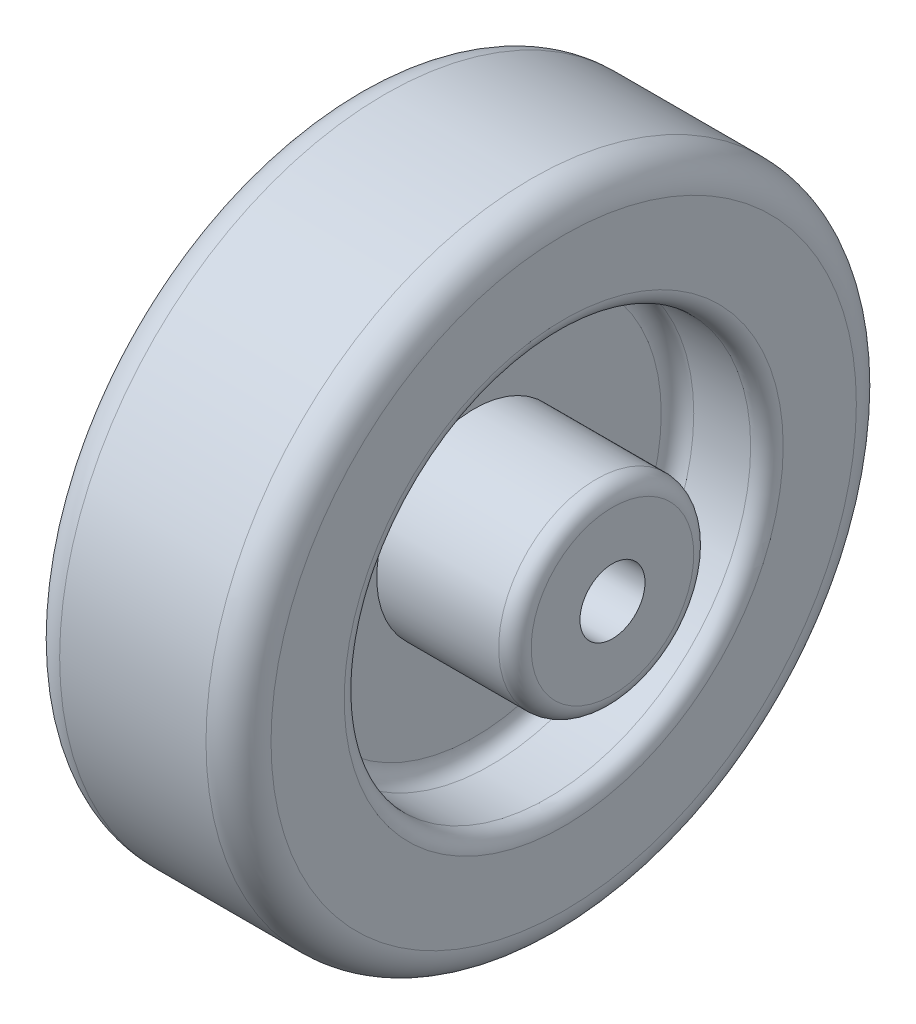
ISO-10303-21;
HEADER;
FILE_DESCRIPTION(('STEP AP214'),'2;1');
FILE_NAME('part.step','',(''),(''),'','','');
FILE_SCHEMA(('AUTOMOTIVE_DESIGN { 1 0 10303 214 1 1 1 1 }'));
ENDSEC;
DATA;
#1=APPLICATION_CONTEXT('core data for automotive mechanical design processes');
#2=APPLICATION_PROTOCOL_DEFINITION('international standard','automotive_design',2000,#1);
#3=PRODUCT_CONTEXT('',#1,'mechanical');
#4=PRODUCT('Part','Part','',(#3));
#5=PRODUCT_RELATED_PRODUCT_CATEGORY('part','',(#4));
#6=PRODUCT_DEFINITION_FORMATION('','',#4);
#7=PRODUCT_DEFINITION_CONTEXT('part definition',#1,'design');
#8=PRODUCT_DEFINITION('design','',#6,#7);
#9=PRODUCT_DEFINITION_SHAPE('','',#8);
#10=(LENGTH_UNIT() NAMED_UNIT(*) SI_UNIT(.MILLI.,.METRE.));
#11=(NAMED_UNIT(*) PLANE_ANGLE_UNIT() SI_UNIT($,.RADIAN.));
#12=(NAMED_UNIT(*) SI_UNIT($,.STERADIAN.) SOLID_ANGLE_UNIT());
#13=UNCERTAINTY_MEASURE_WITH_UNIT(LENGTH_MEASURE(1.E-05),#10,'distance_accuracy_value','');
#14=(GEOMETRIC_REPRESENTATION_CONTEXT(3) GLOBAL_UNCERTAINTY_ASSIGNED_CONTEXT((#13)) GLOBAL_UNIT_ASSIGNED_CONTEXT((#10,
#11,#12)) REPRESENTATION_CONTEXT('',''));
#15=CARTESIAN_POINT('',(0.,0.,0.));
#16=DIRECTION('',(0.,0.,1.));
#17=DIRECTION('',(1.,0.,0.));
#18=AXIS2_PLACEMENT_3D('',#15,#16,#17);
#19=CARTESIAN_POINT('',(-19.,0.,0.));
#20=DIRECTION('',(-1.,0.,0.));
#21=DIRECTION('',(0.,0.,-1.));
#22=AXIS2_PLACEMENT_3D('',#19,#20,#21);
#23=PLANE('',#22);
#24=CARTESIAN_POINT('',(-19.,0.,0.));
#25=DIRECTION('',(-1.,0.,0.));
#26=DIRECTION('',(0.,0.,1.));
#27=AXIS2_PLACEMENT_3D('',#24,#25,#26);
#28=CIRCLE('',#27,10.);
#29=CARTESIAN_POINT('',(-19.,0.,10.));
#30=VERTEX_POINT('',#29);
#31=EDGE_CURVE('E42',#30,#30,#28,.T.);
#32=ORIENTED_EDGE('',*,*,#31,.T.);
#33=EDGE_LOOP('',(#32));
#34=FACE_BOUND('',#33,.T.);
#35=CARTESIAN_POINT('',(-19.,0.,0.));
#36=DIRECTION('',(1.,0.,0.));
#37=DIRECTION('',(0.,0.,-1.));
#38=AXIS2_PLACEMENT_3D('',#35,#36,#37);
#39=CIRCLE('',#38,4.);
#40=CARTESIAN_POINT('',(-19.,0.,-4.));
#41=VERTEX_POINT('',#40);
#42=EDGE_CURVE('E96',#41,#41,#39,.T.);
#43=ORIENTED_EDGE('',*,*,#42,.T.);
#44=EDGE_LOOP('',(#43));
#45=FACE_BOUND('',#44,.T.);
#46=ADVANCED_FACE('F31',(#34,#45),#23,.T.);
#47=CARTESIAN_POINT('',(-13.,0.,0.));
#48=DIRECTION('',(-1.,0.,0.));
#49=DIRECTION('',(0.,0.,-1.));
#50=AXIS2_PLACEMENT_3D('',#47,#48,#49);
#51=PLANE('',#50);
#52=CARTESIAN_POINT('',(-13.,0.,0.));
#53=DIRECTION('',(-1.,0.,0.));
#54=DIRECTION('',(0.,0.,1.));
#55=AXIS2_PLACEMENT_3D('',#52,#53,#54);
#56=CIRCLE('',#55,36.);
#57=CARTESIAN_POINT('',(-13.,0.,36.));
#58=VERTEX_POINT('',#57);
#59=EDGE_CURVE('E10',#58,#58,#56,.T.);
#60=ORIENTED_EDGE('',*,*,#59,.T.);
#61=EDGE_LOOP('',(#60));
#62=FACE_BOUND('',#61,.T.);
#63=CARTESIAN_POINT('',(-13.,0.,0.));
#64=DIRECTION('',(-1.,0.,0.));
#65=DIRECTION('',(0.,0.,1.));
#66=AXIS2_PLACEMENT_3D('',#63,#64,#65);
#67=CIRCLE('',#66,27.);
#68=CARTESIAN_POINT('',(-13.,0.,27.));
#69=VERTEX_POINT('',#68);
#70=EDGE_CURVE('E51',#69,#69,#67,.F.);
#71=ORIENTED_EDGE('',*,*,#70,.T.);
#72=EDGE_LOOP('',(#71));
#73=FACE_BOUND('',#72,.T.);
#74=ADVANCED_FACE('F119',(#62,#73),#51,.T.);
#75=CARTESIAN_POINT('',(2.,0.,0.));
#76=DIRECTION('',(1.,0.,0.));
#77=DIRECTION('',(0.,0.,-1.));
#78=AXIS2_PLACEMENT_3D('',#75,#76,#77);
#79=PLANE('',#78);
#80=CARTESIAN_POINT('',(2.,0.,0.));
#81=DIRECTION('',(1.,0.,0.));
#82=DIRECTION('',(0.,0.,-1.));
#83=AXIS2_PLACEMENT_3D('',#80,#81,#82);
#84=CIRCLE('',#83,23.);
#85=CARTESIAN_POINT('',(2.,0.,-23.));
#86=VERTEX_POINT('',#85);
#87=EDGE_CURVE('E87',#86,#86,#84,.T.);
#88=ORIENTED_EDGE('',*,*,#87,.T.);
#89=EDGE_LOOP('',(#88));
#90=FACE_BOUND('',#89,.T.);
#91=CARTESIAN_POINT('',(2.,0.,0.));
#92=DIRECTION('',(1.,0.,0.));
#93=DIRECTION('',(0.,0.,-1.));
#94=AXIS2_PLACEMENT_3D('',#91,#92,#93);
#95=CIRCLE('',#94,12.);
#96=CARTESIAN_POINT('',(2.,0.,-12.));
#97=VERTEX_POINT('',#96);
#98=EDGE_CURVE('E90',#97,#97,#95,.T.);
#99=ORIENTED_EDGE('',*,*,#98,.F.);
#100=EDGE_LOOP('',(#99));
#101=FACE_BOUND('',#100,.T.);
#102=ADVANCED_FACE('F125',(#90,#101),#79,.T.);
#103=CARTESIAN_POINT('',(13.,0.,0.));
#104=DIRECTION('',(-1.,0.,0.));
#105=DIRECTION('',(0.,0.,1.));
#106=AXIS2_PLACEMENT_3D('',#103,#104,#105);
#107=CYLINDRICAL_SURFACE('',#106,40.);
#108=CARTESIAN_POINT('',(-9.,0.,0.));
#109=DIRECTION('',(-1.,0.,0.));
#110=DIRECTION('',(0.,0.,1.));
#111=AXIS2_PLACEMENT_3D('',#108,#109,#110);
#112=CIRCLE('',#111,40.);
#113=CARTESIAN_POINT('',(-9.,0.,40.));
#114=VERTEX_POINT('',#113);
#115=EDGE_CURVE('E38',#114,#114,#112,.F.);
#116=CARTESIAN_POINT('',(9.,0.,0.));
#117=DIRECTION('',(1.,0.,0.));
#118=DIRECTION('',(0.,0.,-1.));
#119=AXIS2_PLACEMENT_3D('',#116,#117,#118);
#120=CIRCLE('',#119,40.);
#121=CARTESIAN_POINT('',(9.,0.,40.));
#122=VERTEX_POINT('',#121);
#123=EDGE_CURVE('E66',#122,#122,#120,.F.);
#124=CARTESIAN_POINT('',(-9.,0.,40.));
#125=CARTESIAN_POINT('',(-8.8125,0.,40.));
#126=CARTESIAN_POINT('',(-8.62499999999999,0.,40.));
#127=CARTESIAN_POINT('',(-8.24999999999999,0.,40.));
#128=CARTESIAN_POINT('',(-8.06249999999999,0.,40.));
#129=CARTESIAN_POINT('',(-7.6875,0.,40.));
#130=CARTESIAN_POINT('',(-7.5,0.,40.));
#131=CARTESIAN_POINT('',(-7.125,0.,40.));
#132=CARTESIAN_POINT('',(-6.9375,0.,40.));
#133=CARTESIAN_POINT('',(-6.5625,0.,40.));
#134=CARTESIAN_POINT('',(-6.375,0.,40.));
#135=CARTESIAN_POINT('',(-6.,0.,40.));
#136=CARTESIAN_POINT('',(-5.8125,0.,40.));
#137=CARTESIAN_POINT('',(-5.4375,0.,40.));
#138=CARTESIAN_POINT('',(-5.25,0.,40.));
#139=CARTESIAN_POINT('',(-4.875,0.,40.));
#140=CARTESIAN_POINT('',(-4.6875,0.,40.));
#141=CARTESIAN_POINT('',(-4.3125,0.,40.));
#142=CARTESIAN_POINT('',(-4.125,0.,40.));
#143=CARTESIAN_POINT('',(-3.75,0.,40.));
#144=CARTESIAN_POINT('',(-3.5625,0.,40.));
#145=CARTESIAN_POINT('',(-3.1875,0.,40.));
#146=CARTESIAN_POINT('',(-3.,0.,40.));
#147=CARTESIAN_POINT('',(-2.625,0.,40.));
#148=CARTESIAN_POINT('',(-2.4375,0.,40.));
#149=CARTESIAN_POINT('',(-2.0625,0.,40.));
#150=CARTESIAN_POINT('',(-1.875,0.,40.));
#151=CARTESIAN_POINT('',(-1.5,0.,40.));
#152=CARTESIAN_POINT('',(-1.3125,0.,40.));
#153=CARTESIAN_POINT('',(-0.9375,0.,40.));
#154=CARTESIAN_POINT('',(-0.75,0.,40.));
#155=CARTESIAN_POINT('',(-0.375,0.,40.));
#156=CARTESIAN_POINT('',(-0.1875,0.,40.));
#157=CARTESIAN_POINT('',(0.1875,0.,40.));
#158=CARTESIAN_POINT('',(0.375,0.,40.));
#159=CARTESIAN_POINT('',(0.75,0.,40.));
#160=CARTESIAN_POINT('',(0.9375,0.,40.));
#161=CARTESIAN_POINT('',(1.3125,0.,40.));
#162=CARTESIAN_POINT('',(1.5,0.,40.));
#163=CARTESIAN_POINT('',(1.875,0.,40.));
#164=CARTESIAN_POINT('',(2.0625,0.,40.));
#165=CARTESIAN_POINT('',(2.4375,0.,40.));
#166=CARTESIAN_POINT('',(2.625,0.,40.));
#167=CARTESIAN_POINT('',(3.,0.,40.));
#168=CARTESIAN_POINT('',(3.1875,0.,40.));
#169=CARTESIAN_POINT('',(3.5625,0.,40.));
#170=CARTESIAN_POINT('',(3.75,0.,40.));
#171=CARTESIAN_POINT('',(4.125,0.,40.));
#172=CARTESIAN_POINT('',(4.3125,0.,40.));
#173=CARTESIAN_POINT('',(4.6875,0.,40.));
#174=CARTESIAN_POINT('',(4.875,0.,40.));
#175=CARTESIAN_POINT('',(5.25,0.,40.));
#176=CARTESIAN_POINT('',(5.4375,0.,40.));
#177=CARTESIAN_POINT('',(5.8125,0.,40.));
#178=CARTESIAN_POINT('',(6.,0.,40.));
#179=CARTESIAN_POINT('',(6.375,0.,40.));
#180=CARTESIAN_POINT('',(6.5625,0.,40.));
#181=CARTESIAN_POINT('',(6.9375,0.,40.));
#182=CARTESIAN_POINT('',(7.125,0.,40.));
#183=CARTESIAN_POINT('',(7.5,0.,40.));
#184=CARTESIAN_POINT('',(7.6875,0.,40.));
#185=CARTESIAN_POINT('',(8.0625,0.,40.));
#186=CARTESIAN_POINT('',(8.25,0.,40.));
#187=CARTESIAN_POINT('',(8.625,0.,40.));
#188=CARTESIAN_POINT('',(8.8125,0.,40.));
#189=CARTESIAN_POINT('',(9.,0.,40.));
#190=B_SPLINE_CURVE_WITH_KNOTS('',3,(#124,#125,#126,#127,#128,#129,#130,#131,#132,#133,#134,
#135,#136,#137,#138,#139,#140,#141,#142,#143,#144,#145,#146,#147,#148,#149,#150,#151,#152,#153,
#154,#155,#156,#157,#158,#159,#160,#161,#162,#163,#164,#165,#166,#167,#168,#169,#170,#171,#172,
#173,#174,#175,#176,#177,#178,#179,#180,#181,#182,#183,#184,#185,#186,#187,#188,#189),
.UNSPECIFIED.,.F.,.F.,(4,2,2,2,2,2,2,2,2,2,2,2,2,2,2,2,2,2,2,2,2,2,2,2,2,2,2,2,2,2,2,2,4),(0.,
0.5625,1.125,1.6875,2.25,2.8125,3.375,3.9375,4.5,5.0625,5.625,6.1875,6.75,7.3125,7.875,
8.43749999999999,9.,9.5625,10.125,10.6875,11.25,11.8125,12.375,12.9375,13.5,14.0625,14.625,
15.1875,15.75,16.3125,16.875,17.4375,18.),.UNSPECIFIED.);
#191=EDGE_CURVE('BSEAM171',#114,#122,#190,.T.);
#192=ORIENTED_EDGE('',*,*,#115,.T.);
#193=ORIENTED_EDGE('',*,*,#123,.T.);
#194=ORIENTED_EDGE('',*,*,#191,.T.);
#195=ORIENTED_EDGE('',*,*,#191,.F.);
#196=EDGE_LOOP('',(#192,#194,#193,#195));
#197=FACE_BOUND('',#196,.T.);
#198=ADVANCED_FACE('F171',(#197),#107,.T.);
#199=CARTESIAN_POINT('',(13.,0.,0.));
#200=DIRECTION('',(1.,0.,0.));
#201=DIRECTION('',(0.,0.,-1.));
#202=AXIS2_PLACEMENT_3D('',#199,#200,#201);
#203=PLANE('',#202);
#204=CARTESIAN_POINT('',(13.,0.,0.));
#205=DIRECTION('',(1.,0.,0.));
#206=DIRECTION('',(0.,0.,-1.));
#207=AXIS2_PLACEMENT_3D('',#204,#205,#206);
#208=CIRCLE('',#207,36.);
#209=CARTESIAN_POINT('',(13.,0.,-36.));
#210=VERTEX_POINT('',#209);
#211=EDGE_CURVE('E69',#210,#210,#208,.T.);
#212=ORIENTED_EDGE('',*,*,#211,.T.);
#213=EDGE_LOOP('',(#212));
#214=FACE_BOUND('',#213,.T.);
#215=CARTESIAN_POINT('',(13.,0.,0.));
#216=DIRECTION('',(1.,0.,0.));
#217=DIRECTION('',(0.,0.,-1.));
#218=AXIS2_PLACEMENT_3D('',#215,#216,#217);
#219=CIRCLE('',#218,27.);
#220=CARTESIAN_POINT('',(13.,0.,-27.));
#221=VERTEX_POINT('',#220);
#222=EDGE_CURVE('E78',#221,#221,#219,.F.);
#223=ORIENTED_EDGE('',*,*,#222,.T.);
#224=EDGE_LOOP('',(#223));
#225=FACE_BOUND('',#224,.T.);
#226=ADVANCED_FACE('F174',(#214,#225),#203,.T.);
#227=CARTESIAN_POINT('',(2.,0.,0.));
#228=DIRECTION('',(1.,0.,0.));
#229=DIRECTION('',(0.,0.,-1.));
#230=AXIS2_PLACEMENT_3D('',#227,#228,#229);
#231=CYLINDRICAL_SURFACE('',#230,25.);
#232=CARTESIAN_POINT('',(4.,0.,0.));
#233=DIRECTION('',(1.,0.,0.));
#234=DIRECTION('',(0.,0.,-1.));
#235=AXIS2_PLACEMENT_3D('',#232,#233,#234);
#236=CIRCLE('',#235,25.);
#237=CARTESIAN_POINT('',(4.,0.,-25.));
#238=VERTEX_POINT('',#237);
#239=EDGE_CURVE('E81',#238,#238,#236,.F.);
#240=ORIENTED_EDGE('',*,*,#239,.T.);
#241=EDGE_LOOP('',(#240));
#242=FACE_BOUND('',#241,.T.);
#243=CARTESIAN_POINT('',(11.,0.,0.));
#244=DIRECTION('',(1.,0.,0.));
#245=DIRECTION('',(0.,0.,-1.));
#246=AXIS2_PLACEMENT_3D('',#243,#244,#245);
#247=CIRCLE('',#246,25.);
#248=CARTESIAN_POINT('',(11.,0.,-25.));
#249=VERTEX_POINT('',#248);
#250=EDGE_CURVE('E84',#249,#249,#247,.T.);
#251=ORIENTED_EDGE('',*,*,#250,.T.);
#252=EDGE_LOOP('',(#251));
#253=FACE_BOUND('',#252,.T.);
#254=ADVANCED_FACE('F177',(#242,#253),#231,.F.);
#255=CARTESIAN_POINT('',(19.,0.,0.));
#256=DIRECTION('',(-1.,0.,0.));
#257=DIRECTION('',(0.,0.,1.));
#258=AXIS2_PLACEMENT_3D('',#255,#256,#257);
#259=CYLINDRICAL_SURFACE('',#258,12.);
#260=CARTESIAN_POINT('',(17.,0.,0.));
#261=DIRECTION('',(1.,0.,0.));
#262=DIRECTION('',(0.,0.,-1.));
#263=AXIS2_PLACEMENT_3D('',#260,#261,#262);
#264=CIRCLE('',#263,12.);
#265=CARTESIAN_POINT('',(17.,0.,-12.));
#266=VERTEX_POINT('',#265);
#267=EDGE_CURVE('E72',#266,#266,#264,.F.);
#268=ORIENTED_EDGE('',*,*,#267,.T.);
#269=EDGE_LOOP('',(#268));
#270=FACE_BOUND('',#269,.T.);
#271=ORIENTED_EDGE('',*,*,#98,.T.);
#272=EDGE_LOOP('',(#271));
#273=FACE_BOUND('',#272,.T.);
#274=ADVANCED_FACE('F114',(#270,#273),#259,.T.);
#275=CARTESIAN_POINT('',(19.,0.,0.));
#276=DIRECTION('',(1.,0.,0.));
#277=DIRECTION('',(0.,0.,-1.));
#278=AXIS2_PLACEMENT_3D('',#275,#276,#277);
#279=PLANE('',#278);
#280=CARTESIAN_POINT('',(19.,0.,0.));
#281=DIRECTION('',(1.,0.,0.));
#282=DIRECTION('',(0.,0.,-1.));
#283=AXIS2_PLACEMENT_3D('',#280,#281,#282);
#284=CIRCLE('',#283,10.);
#285=CARTESIAN_POINT('',(19.,0.,-10.));
#286=VERTEX_POINT('',#285);
#287=EDGE_CURVE('E75',#286,#286,#284,.T.);
#288=ORIENTED_EDGE('',*,*,#287,.T.);
#289=EDGE_LOOP('',(#288));
#290=FACE_BOUND('',#289,.T.);
#291=CARTESIAN_POINT('',(19.,0.,0.));
#292=DIRECTION('',(1.,0.,0.));
#293=DIRECTION('',(0.,0.,-1.));
#294=AXIS2_PLACEMENT_3D('',#291,#292,#293);
#295=CIRCLE('',#294,4.);
#296=CARTESIAN_POINT('',(19.,0.,-4.));
#297=VERTEX_POINT('',#296);
#298=EDGE_CURVE('E93',#297,#297,#295,.T.);
#299=ORIENTED_EDGE('',*,*,#298,.F.);
#300=EDGE_LOOP('',(#299));
#301=FACE_BOUND('',#300,.T.);
#302=ADVANCED_FACE('F104',(#290,#301),#279,.T.);
#303=CARTESIAN_POINT('',(0.,0.,0.));
#304=DIRECTION('',(1.,0.,0.));
#305=DIRECTION('',(0.,0.,-1.));
#306=AXIS2_PLACEMENT_3D('',#303,#304,#305);
#307=CYLINDRICAL_SURFACE('',#306,4.);
#308=ORIENTED_EDGE('',*,*,#298,.T.);
#309=EDGE_LOOP('',(#308));
#310=FACE_BOUND('',#309,.T.);
#311=ORIENTED_EDGE('',*,*,#42,.F.);
#312=EDGE_LOOP('',(#311));
#313=FACE_BOUND('',#312,.T.);
#314=ADVANCED_FACE('F101',(#310,#313),#307,.F.);
#315=CARTESIAN_POINT('',(4.,0.,0.));
#316=DIRECTION('',(1.,0.,0.));
#317=DIRECTION('',(0.,0.,-1.));
#318=AXIS2_PLACEMENT_3D('',#315,#316,#317);
#319=TOROIDAL_SURFACE('',#318,23.,2.);
#320=ORIENTED_EDGE('',*,*,#239,.F.);
#321=EDGE_LOOP('',(#320));
#322=FACE_BOUND('',#321,.T.);
#323=ORIENTED_EDGE('',*,*,#87,.F.);
#324=EDGE_LOOP('',(#323));
#325=FACE_BOUND('',#324,.T.);
#326=ADVANCED_FACE('F103',(#322,#325),#319,.F.);
#327=CARTESIAN_POINT('',(11.,0.,0.));
#328=DIRECTION('',(1.,0.,0.));
#329=DIRECTION('',(0.,0.,-1.));
#330=AXIS2_PLACEMENT_3D('',#327,#328,#329);
#331=TOROIDAL_SURFACE('',#330,27.,2.);
#332=ORIENTED_EDGE('',*,*,#222,.F.);
#333=EDGE_LOOP('',(#332));
#334=FACE_BOUND('',#333,.T.);
#335=ORIENTED_EDGE('',*,*,#250,.F.);
#336=EDGE_LOOP('',(#335));
#337=FACE_BOUND('',#336,.T.);
#338=ADVANCED_FACE('F111',(#334,#337),#331,.T.);
#339=CARTESIAN_POINT('',(17.,0.,0.));
#340=DIRECTION('',(1.,0.,0.));
#341=DIRECTION('',(0.,0.,-1.));
#342=AXIS2_PLACEMENT_3D('',#339,#340,#341);
#343=TOROIDAL_SURFACE('',#342,10.,2.);
#344=ORIENTED_EDGE('',*,*,#267,.F.);
#345=EDGE_LOOP('',(#344));
#346=FACE_BOUND('',#345,.T.);
#347=ORIENTED_EDGE('',*,*,#287,.F.);
#348=EDGE_LOOP('',(#347));
#349=FACE_BOUND('',#348,.T.);
#350=ADVANCED_FACE('F143',(#346,#349),#343,.T.);
#351=CARTESIAN_POINT('',(9.,0.,0.));
#352=DIRECTION('',(1.,0.,0.));
#353=DIRECTION('',(0.,0.,-1.));
#354=AXIS2_PLACEMENT_3D('',#351,#352,#353);
#355=TOROIDAL_SURFACE('',#354,36.,4.);
#356=ORIENTED_EDGE('',*,*,#123,.F.);
#357=EDGE_LOOP('',(#356));
#358=FACE_BOUND('',#357,.T.);
#359=ORIENTED_EDGE('',*,*,#211,.F.);
#360=EDGE_LOOP('',(#359));
#361=FACE_BOUND('',#360,.T.);
#362=ADVANCED_FACE('F138',(#358,#361),#355,.T.);
#363=CARTESIAN_POINT('',(-2.,0.,0.));
#364=DIRECTION('',(-1.,0.,0.));
#365=DIRECTION('',(0.,0.,1.));
#366=AXIS2_PLACEMENT_3D('',#363,#364,#365);
#367=CYLINDRICAL_SURFACE('',#366,25.);
#368=CARTESIAN_POINT('',(-4.,0.,0.));
#369=DIRECTION('',(-1.,0.,0.));
#370=DIRECTION('',(0.,0.,1.));
#371=AXIS2_PLACEMENT_3D('',#368,#369,#370);
#372=CIRCLE('',#371,25.);
#373=CARTESIAN_POINT('',(-4.,0.,25.));
#374=VERTEX_POINT('',#373);
#375=EDGE_CURVE('E57',#374,#374,#372,.F.);
#376=ORIENTED_EDGE('',*,*,#375,.T.);
#377=EDGE_LOOP('',(#376));
#378=FACE_BOUND('',#377,.T.);
#379=CARTESIAN_POINT('',(-11.,0.,0.));
#380=DIRECTION('',(-1.,0.,0.));
#381=DIRECTION('',(0.,0.,1.));
#382=AXIS2_PLACEMENT_3D('',#379,#380,#381);
#383=CIRCLE('',#382,25.);
#384=CARTESIAN_POINT('',(-11.,0.,25.));
#385=VERTEX_POINT('',#384);
#386=EDGE_CURVE('E60',#385,#385,#383,.T.);
#387=ORIENTED_EDGE('',*,*,#386,.T.);
#388=EDGE_LOOP('',(#387));
#389=FACE_BOUND('',#388,.T.);
#390=ADVANCED_FACE('F135',(#378,#389),#367,.F.);
#391=CARTESIAN_POINT('',(-2.,0.,0.));
#392=DIRECTION('',(-1.,0.,0.));
#393=DIRECTION('',(0.,0.,-1.));
#394=AXIS2_PLACEMENT_3D('',#391,#392,#393);
#395=PLANE('',#394);
#396=CARTESIAN_POINT('',(-2.,0.,0.));
#397=DIRECTION('',(-1.,0.,0.));
#398=DIRECTION('',(0.,0.,1.));
#399=AXIS2_PLACEMENT_3D('',#396,#397,#398);
#400=CIRCLE('',#399,23.);
#401=CARTESIAN_POINT('',(-2.,0.,23.));
#402=VERTEX_POINT('',#401);
#403=EDGE_CURVE('E54',#402,#402,#400,.T.);
#404=ORIENTED_EDGE('',*,*,#403,.T.);
#405=EDGE_LOOP('',(#404));
#406=FACE_BOUND('',#405,.T.);
#407=CARTESIAN_POINT('',(-2.,0.,0.));
#408=DIRECTION('',(-1.,0.,0.));
#409=DIRECTION('',(0.,0.,1.));
#410=AXIS2_PLACEMENT_3D('',#407,#408,#409);
#411=CIRCLE('',#410,12.);
#412=CARTESIAN_POINT('',(-2.,0.,12.));
#413=VERTEX_POINT('',#412);
#414=EDGE_CURVE('E63',#413,#413,#411,.T.);
#415=ORIENTED_EDGE('',*,*,#414,.F.);
#416=EDGE_LOOP('',(#415));
#417=FACE_BOUND('',#416,.T.);
#418=ADVANCED_FACE('F131',(#406,#417),#395,.T.);
#419=CARTESIAN_POINT('',(-19.,0.,0.));
#420=DIRECTION('',(1.,0.,0.));
#421=DIRECTION('',(0.,0.,-1.));
#422=AXIS2_PLACEMENT_3D('',#419,#420,#421);
#423=CYLINDRICAL_SURFACE('',#422,12.);
#424=CARTESIAN_POINT('',(-17.,0.,0.));
#425=DIRECTION('',(-1.,0.,0.));
#426=DIRECTION('',(0.,0.,1.));
#427=AXIS2_PLACEMENT_3D('',#424,#425,#426);
#428=CIRCLE('',#427,12.);
#429=CARTESIAN_POINT('',(-17.,0.,12.));
#430=VERTEX_POINT('',#429);
#431=EDGE_CURVE('E46',#430,#430,#428,.F.);
#432=ORIENTED_EDGE('',*,*,#431,.T.);
#433=EDGE_LOOP('',(#432));
#434=FACE_BOUND('',#433,.T.);
#435=ORIENTED_EDGE('',*,*,#414,.T.);
#436=EDGE_LOOP('',(#435));
#437=FACE_BOUND('',#436,.T.);
#438=ADVANCED_FACE('F127',(#434,#437),#423,.T.);
#439=CARTESIAN_POINT('',(-4.,0.,0.));
#440=DIRECTION('',(-1.,0.,0.));
#441=DIRECTION('',(0.,0.,1.));
#442=AXIS2_PLACEMENT_3D('',#439,#440,#441);
#443=TOROIDAL_SURFACE('',#442,23.,2.);
#444=ORIENTED_EDGE('',*,*,#403,.F.);
#445=EDGE_LOOP('',(#444));
#446=FACE_BOUND('',#445,.T.);
#447=ORIENTED_EDGE('',*,*,#375,.F.);
#448=EDGE_LOOP('',(#447));
#449=FACE_BOUND('',#448,.T.);
#450=ADVANCED_FACE('F130',(#446,#449),#443,.F.);
#451=CARTESIAN_POINT('',(-11.,0.,0.));
#452=DIRECTION('',(-1.,0.,0.));
#453=DIRECTION('',(0.,0.,1.));
#454=AXIS2_PLACEMENT_3D('',#451,#452,#453);
#455=TOROIDAL_SURFACE('',#454,27.,2.);
#456=ORIENTED_EDGE('',*,*,#386,.F.);
#457=EDGE_LOOP('',(#456));
#458=FACE_BOUND('',#457,.T.);
#459=ORIENTED_EDGE('',*,*,#70,.F.);
#460=EDGE_LOOP('',(#459));
#461=FACE_BOUND('',#460,.T.);
#462=ADVANCED_FACE('F150',(#458,#461),#455,.T.);
#463=CARTESIAN_POINT('',(-17.,0.,0.));
#464=DIRECTION('',(-1.,0.,0.));
#465=DIRECTION('',(0.,0.,1.));
#466=AXIS2_PLACEMENT_3D('',#463,#464,#465);
#467=TOROIDAL_SURFACE('',#466,10.,2.);
#468=ORIENTED_EDGE('',*,*,#31,.F.);
#469=EDGE_LOOP('',(#468));
#470=FACE_BOUND('',#469,.T.);
#471=ORIENTED_EDGE('',*,*,#431,.F.);
#472=EDGE_LOOP('',(#471));
#473=FACE_BOUND('',#472,.T.);
#474=ADVANCED_FACE('F153',(#470,#473),#467,.T.);
#475=CARTESIAN_POINT('',(-9.,0.,0.));
#476=DIRECTION('',(-1.,0.,0.));
#477=DIRECTION('',(0.,0.,1.));
#478=AXIS2_PLACEMENT_3D('',#475,#476,#477);
#479=TOROIDAL_SURFACE('',#478,36.,4.);
#480=ORIENTED_EDGE('',*,*,#59,.F.);
#481=EDGE_LOOP('',(#480));
#482=FACE_BOUND('',#481,.T.);
#483=ORIENTED_EDGE('',*,*,#115,.F.);
#484=EDGE_LOOP('',(#483));
#485=FACE_BOUND('',#484,.T.);
#486=ADVANCED_FACE('F33',(#482,#485),#479,.T.);
#487=CLOSED_SHELL('',(#46,#74,#102,#198,#226,#254,#274,#302,#314,#326,#338,#350,#362,#390,#418,
#438,#450,#462,#474,#486));
#488=MANIFOLD_SOLID_BREP('B2',#487);
#489=ADVANCED_BREP_SHAPE_REPRESENTATION('',(#18,#488),#14);
#490=SHAPE_DEFINITION_REPRESENTATION(#9,#489);
ENDSEC;
END-ISO-10303-21;
